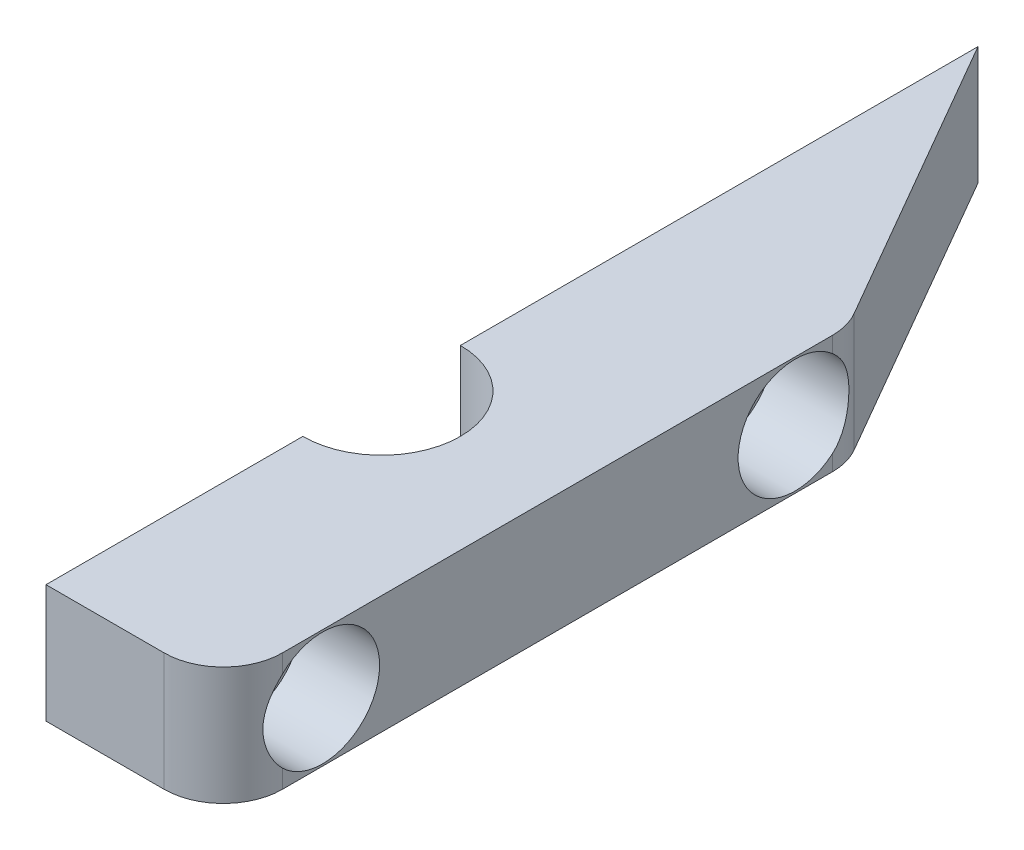
ISO-10303-21;
HEADER;
FILE_DESCRIPTION(('STEP AP214'),'2;1');
FILE_NAME('part.step','',(''),(''),'','','');
FILE_SCHEMA(('AUTOMOTIVE_DESIGN { 1 0 10303 214 1 1 1 1 }'));
ENDSEC;
DATA;
#1=APPLICATION_CONTEXT('core data for automotive mechanical design processes');
#2=APPLICATION_PROTOCOL_DEFINITION('international standard','automotive_design',2000,#1);
#3=PRODUCT_CONTEXT('',#1,'mechanical');
#4=PRODUCT('Part','Part','',(#3));
#5=PRODUCT_RELATED_PRODUCT_CATEGORY('part','',(#4));
#6=PRODUCT_DEFINITION_FORMATION('','',#4);
#7=PRODUCT_DEFINITION_CONTEXT('part definition',#1,'design');
#8=PRODUCT_DEFINITION('design','',#6,#7);
#9=PRODUCT_DEFINITION_SHAPE('','',#8);
#10=(LENGTH_UNIT() NAMED_UNIT(*) SI_UNIT(.MILLI.,.METRE.));
#11=(NAMED_UNIT(*) PLANE_ANGLE_UNIT() SI_UNIT($,.RADIAN.));
#12=(NAMED_UNIT(*) SI_UNIT($,.STERADIAN.) SOLID_ANGLE_UNIT());
#13=UNCERTAINTY_MEASURE_WITH_UNIT(LENGTH_MEASURE(1.E-05),#10,'distance_accuracy_value','');
#14=(GEOMETRIC_REPRESENTATION_CONTEXT(3) GLOBAL_UNCERTAINTY_ASSIGNED_CONTEXT((#13)) GLOBAL_UNIT_ASSIGNED_CONTEXT((#10,
#11,#12)) REPRESENTATION_CONTEXT('',''));
#15=CARTESIAN_POINT('',(0.,0.,0.));
#16=DIRECTION('',(0.,0.,1.));
#17=DIRECTION('',(1.,0.,0.));
#18=AXIS2_PLACEMENT_3D('',#15,#16,#17);
#19=CARTESIAN_POINT('',(-260.999999761582,0.,1.15907283664988E-13));
#20=DIRECTION('',(1.,0.,0.));
#21=DIRECTION('',(0.,0.,-1.));
#22=AXIS2_PLACEMENT_3D('',#19,#20,#21);
#23=PLANE('',#22);
#24=DIRECTION('',(0.,1.,0.));
#25=VECTOR('',#24,1.);
#26=CARTESIAN_POINT('',(-260.999999761582,-63.35359244469,-282.931089070943));
#27=LINE('',#26,#25);
#28=CARTESIAN_POINT('',(-260.999999761582,-5.80000000000001,-282.931089070943));
#29=VERTEX_POINT('',#28);
#30=CARTESIAN_POINT('',(-260.999999761582,0.199999999999965,-282.931089070943));
#31=VERTEX_POINT('',#30);
#32=EDGE_CURVE('E232',#29,#31,#27,.T.);
#33=ORIENTED_EDGE('',*,*,#32,.T.);
#34=DIRECTION('',(0.,0.,1.));
#35=VECTOR('',#34,1.);
#36=CARTESIAN_POINT('',(-260.999999761582,0.19999999999996,-268.967768872497));
#37=LINE('',#36,#35);
#38=CARTESIAN_POINT('',(-260.999999761582,0.19999999999997,-295.967768872497));
#39=VERTEX_POINT('',#38);
#40=EDGE_CURVE('E54',#39,#31,#37,.T.);
#41=ORIENTED_EDGE('',*,*,#40,.F.);
#42=DIRECTION('',(0.,1.,0.));
#43=VECTOR('',#42,1.);
#44=CARTESIAN_POINT('',(-260.999999761582,-63.35359244469,-295.967768872497));
#45=LINE('',#44,#43);
#46=CARTESIAN_POINT('',(-260.999999761582,-5.80000000000001,-295.967768872497));
#47=VERTEX_POINT('',#46);
#48=EDGE_CURVE('E239',#47,#39,#45,.T.);
#49=ORIENTED_EDGE('',*,*,#48,.F.);
#50=DIRECTION('',(0.,0.,-1.));
#51=VECTOR('',#50,1.);
#52=CARTESIAN_POINT('',(-260.999999761582,-5.80000000000014,1.13331797544321E-13));
#53=LINE('',#52,#51);
#54=EDGE_CURVE('E61',#29,#47,#53,.T.);
#55=ORIENTED_EDGE('',*,*,#54,.F.);
#56=EDGE_LOOP('',(#33,#41,#49,#55));
#57=FACE_BOUND('',#56,.T.);
#58=CARTESIAN_POINT('',(-260.999999761582,-2.80000000000014,-287.967768872497));
#59=DIRECTION('',(1.,0.,0.));
#60=DIRECTION('',(0.,0.,-1.));
#61=AXIS2_PLACEMENT_3D('',#58,#59,#60);
#62=CIRCLE('',#61,1.40000000000003);
#63=CARTESIAN_POINT('',(-260.999999761582,-2.80000000000014,-289.367768872497));
#64=VERTEX_POINT('',#63);
#65=EDGE_CURVE('E46',#64,#64,#62,.T.);
#66=ORIENTED_EDGE('',*,*,#65,.T.);
#67=EDGE_LOOP('',(#66));
#68=FACE_BOUND('',#67,.T.);
#69=ADVANCED_FACE('F38',(#57,#68),#23,.F.);
#70=DIRECTION('',(0.,-1.,0.));
#71=VECTOR('',#70,1.);
#72=CARTESIAN_POINT('',(-260.999999761582,-63.35359244469,-330.246986621157));
#73=LINE('',#72,#71);
#74=CARTESIAN_POINT('',(-260.999999761582,0.199999999999982,-330.246986621157));
#75=VERTEX_POINT('',#74);
#76=CARTESIAN_POINT('',(-260.999999761582,-5.8,-330.246986621157));
#77=VERTEX_POINT('',#76);
#78=EDGE_CURVE('E41',#75,#77,#73,.T.);
#79=ORIENTED_EDGE('',*,*,#78,.T.);
#80=CARTESIAN_POINT('',(-260.999999761582,-5.80000000000001,-303.967768872497));
#81=VERTEX_POINT('',#80);
#82=EDGE_CURVE('E244',#81,#77,#53,.T.);
#83=ORIENTED_EDGE('',*,*,#82,.F.);
#84=DIRECTION('',(0.,1.,0.));
#85=VECTOR('',#84,1.);
#86=CARTESIAN_POINT('',(-260.999999761582,-63.35359244469,-303.967768872497));
#87=LINE('',#86,#85);
#88=CARTESIAN_POINT('',(-260.999999761582,0.199999999999972,-303.967768872497));
#89=VERTEX_POINT('',#88);
#90=EDGE_CURVE('E241',#89,#81,#87,.F.);
#91=ORIENTED_EDGE('',*,*,#90,.F.);
#92=EDGE_CURVE('E242',#75,#89,#37,.T.);
#93=ORIENTED_EDGE('',*,*,#92,.F.);
#94=EDGE_LOOP('',(#79,#83,#91,#93));
#95=FACE_BOUND('',#94,.T.);
#96=CARTESIAN_POINT('',(-260.999999761582,-2.80000000000014,-311.967768872497));
#97=DIRECTION('',(1.,0.,0.));
#98=DIRECTION('',(0.,0.,-1.));
#99=AXIS2_PLACEMENT_3D('',#96,#97,#98);
#100=CIRCLE('',#99,1.40000000000003);
#101=CARTESIAN_POINT('',(-260.999999761582,-2.80000000000014,-313.367768872497));
#102=VERTEX_POINT('',#101);
#103=EDGE_CURVE('E11',#102,#102,#100,.T.);
#104=ORIENTED_EDGE('',*,*,#103,.T.);
#105=EDGE_LOOP('',(#104));
#106=FACE_BOUND('',#105,.T.);
#107=ADVANCED_FACE('F179',(#95,#106),#23,.F.);
#108=CARTESIAN_POINT('',(-245.999999761582,-2.80000000000014,-311.967768872497));
#109=DIRECTION('',(-1.,0.,0.));
#110=DIRECTION('',(0.,0.,1.));
#111=AXIS2_PLACEMENT_3D('',#108,#109,#110);
#112=CYLINDRICAL_SURFACE('',#111,2.9);
#113=CARTESIAN_POINT('',(-251.999999761582,-0.597828413688027,-313.854681775744));
#114=CARTESIAN_POINT('',(-252.000000187371,-0.650026521575095,-313.915606078897));
#115=CARTESIAN_POINT('',(-252.001855104516,-0.704712248521364,-313.974304651285));
#116=CARTESIAN_POINT('',(-252.00846676525,-0.818618674633444,-314.086856591232));
#117=CARTESIAN_POINT('',(-252.01322115679,-0.877835664031156,-314.140713845471));
#118=CARTESIAN_POINT('',(-252.030607777836,-1.06152007490764,-314.29437834261));
#119=CARTESIAN_POINT('',(-252.046369697883,-1.19222599039769,-314.386516679174));
#120=CARTESIAN_POINT('',(-252.080007156013,-1.46634251875561,-314.547818984672));
#121=CARTESIAN_POINT('',(-252.09787832646,-1.60972672928531,-314.617029336824));
#122=CARTESIAN_POINT('',(-252.130282134643,-1.90633621674094,-314.731197793266));
#123=CARTESIAN_POINT('',(-252.14481530553,-2.05955991707947,-314.776159772091));
#124=CARTESIAN_POINT('',(-252.161107529667,-2.29547654310155,-314.824715134062));
#125=CARTESIAN_POINT('',(-252.165639989769,-2.37613432517293,-314.837790076737));
#126=CARTESIAN_POINT('',(-252.172408172329,-2.53838319222992,-314.857097784886));
#127=CARTESIAN_POINT('',(-252.174643878262,-2.61997428392626,-314.86333050113));
#128=CARTESIAN_POINT('',(-252.176628533492,-2.7833927793076,-314.868873138064));
#129=CARTESIAN_POINT('',(-252.176378372573,-2.86522008795833,-314.86818553579));
#130=CARTESIAN_POINT('',(-252.173425432352,-3.02845815877751,-314.859912358808));
#131=CARTESIAN_POINT('',(-252.170722742133,-3.10986893596766,-314.852327034648));
#132=CARTESIAN_POINT('',(-252.15963699582,-3.34350896570897,-314.820540397204));
#133=CARTESIAN_POINT('',(-252.148341804349,-3.49449909614322,-314.787568443504));
#134=CARTESIAN_POINT('',(-252.120678661784,-3.78898318011138,-314.698274479706));
#135=CARTESIAN_POINT('',(-252.104304673654,-3.93246797376998,-314.641924653877));
#136=CARTESIAN_POINT('',(-252.070307667822,-4.21462545853687,-314.504405713176));
#137=CARTESIAN_POINT('',(-252.052661218944,-4.3528257546319,-314.422273360339));
#138=CARTESIAN_POINT('',(-252.022861430462,-4.61393095895006,-314.2360760334));
#139=CARTESIAN_POINT('',(-252.010692608637,-4.73687825630902,-314.132074110583));
#140=CARTESIAN_POINT('',(-252.003040261791,-4.87672288942201,-313.992273599532));
#141=CARTESIAN_POINT('',(-252.001919728184,-4.90255609249165,-313.965430202243));
#142=CARTESIAN_POINT('',(-252.000399964289,-4.95316097923084,-313.910776548533));
#143=CARTESIAN_POINT('',(-252.000000226606,-4.97793339762557,-313.8829669863));
#144=CARTESIAN_POINT('',(-251.999999761582,-5.00217158631223,-313.854681775744));
#145=B_SPLINE_CURVE_WITH_KNOTS('',3,(#113,#114,#115,#116,#117,#118,#119,#120,#121,#122,#123,
#124,#125,#126,#127,#128,#129,#130,#131,#132,#133,#134,#135,#136,#137,#138,#139,#140,#141,#142,
#143,#144),.UNSPECIFIED.,.F.,.F.,(4,2,2,2,2,2,2,2,2,2,2,2,2,2,2,4),(0.,0.240468749721633,
0.480742690563356,0.960360174862351,1.43900138407407,1.91756609075778,2.16280425267044,
2.40804417901727,2.65319632816666,2.89833957297843,3.36093697853722,3.82408638290194,
4.30715583472027,4.78885120851682,4.90064388869704,5.01235784296295),.UNSPECIFIED.);
#146=CARTESIAN_POINT('',(-251.999999761582,-0.597828413688027,-313.854681775744));
#147=VERTEX_POINT('',#146);
#148=CARTESIAN_POINT('',(-251.999999761582,-5.00217158631226,-313.854681775744));
#149=VERTEX_POINT('',#148);
#150=EDGE_CURVE('E116',#147,#149,#145,.T.);
#151=ORIENTED_EDGE('',*,*,#150,.F.);
#152=CARTESIAN_POINT('',(-251.999999761582,-2.80000000000014,-311.967768872497));
#153=DIRECTION('',(1.,0.,0.));
#154=DIRECTION('',(0.,0.,-1.));
#155=AXIS2_PLACEMENT_3D('',#152,#153,#154);
#156=CIRCLE('',#155,2.9);
#157=EDGE_CURVE('E120',#149,#147,#156,.F.);
#158=ORIENTED_EDGE('',*,*,#157,.F.);
#159=EDGE_LOOP('',(#151,#158));
#160=FACE_BOUND('',#159,.T.);
#161=CARTESIAN_POINT('',(-255.999999761582,-2.80000000000014,-311.967768872497));
#162=DIRECTION('',(1.,0.,0.));
#163=DIRECTION('',(0.,0.,-1.));
#164=AXIS2_PLACEMENT_3D('',#161,#162,#163);
#165=CIRCLE('',#164,2.9);
#166=CARTESIAN_POINT('',(-255.999999761582,-2.80000000000014,-314.867768872497));
#167=VERTEX_POINT('',#166);
#168=EDGE_CURVE('E288',#167,#167,#165,.T.);
#169=ORIENTED_EDGE('',*,*,#168,.F.);
#170=EDGE_LOOP('',(#169));
#171=FACE_BOUND('',#170,.T.);
#172=ADVANCED_FACE('F118',(#160,#171),#112,.F.);
#173=CARTESIAN_POINT('',(-255.999999761582,-2.80000000000014,-311.967768872497));
#174=DIRECTION('',(1.,0.,0.));
#175=DIRECTION('',(0.,0.,-1.));
#176=AXIS2_PLACEMENT_3D('',#173,#174,#175);
#177=PLANE('',#176);
#178=CARTESIAN_POINT('',(-255.999999761582,-2.80000000000014,-311.967768872497));
#179=DIRECTION('',(1.,0.,0.));
#180=DIRECTION('',(0.,0.,-1.));
#181=AXIS2_PLACEMENT_3D('',#178,#179,#180);
#182=CIRCLE('',#181,1.40000000000003);
#183=CARTESIAN_POINT('',(-255.999999761582,-2.80000000000014,-313.367768872497));
#184=VERTEX_POINT('',#183);
#185=EDGE_CURVE('E137',#184,#184,#182,.T.);
#186=ORIENTED_EDGE('',*,*,#185,.F.);
#187=EDGE_LOOP('',(#186));
#188=FACE_BOUND('',#187,.T.);
#189=ORIENTED_EDGE('',*,*,#168,.T.);
#190=EDGE_LOOP('',(#189));
#191=FACE_BOUND('',#190,.T.);
#192=ADVANCED_FACE('F178',(#188,#191),#177,.T.);
#193=CARTESIAN_POINT('',(-251.999999761582,-2.80000000000014,-311.967768872497));
#194=DIRECTION('',(-1.,0.,0.));
#195=DIRECTION('',(0.,0.,1.));
#196=AXIS2_PLACEMENT_3D('',#193,#194,#195);
#197=CYLINDRICAL_SURFACE('',#196,1.40000000000003);
#198=ORIENTED_EDGE('',*,*,#103,.F.);
#199=EDGE_LOOP('',(#198));
#200=FACE_BOUND('',#199,.T.);
#201=ORIENTED_EDGE('',*,*,#185,.T.);
#202=EDGE_LOOP('',(#201));
#203=FACE_BOUND('',#202,.T.);
#204=ADVANCED_FACE('F185',(#200,#203),#197,.F.);
#205=CARTESIAN_POINT('',(-245.999999761582,-2.80000000000014,-287.967768872497));
#206=DIRECTION('',(-1.,0.,0.));
#207=DIRECTION('',(0.,0.,1.));
#208=AXIS2_PLACEMENT_3D('',#205,#206,#207);
#209=CYLINDRICAL_SURFACE('',#208,2.9);
#210=CARTESIAN_POINT('',(-251.999999761582,-4.86444553959227,-285.931089070943));
#211=CARTESIAN_POINT('',(-252.00000252456,-4.80775508545468,-285.873620106478));
#212=CARTESIAN_POINT('',(-252.001650473643,-4.7487036266145,-285.818569681027));
#213=CARTESIAN_POINT('',(-252.007428129747,-4.62632892630314,-285.713659168226));
#214=CARTESIAN_POINT('',(-252.011556285464,-4.56300837699605,-285.663795859323));
#215=CARTESIAN_POINT('',(-252.026442191381,-4.36735519336352,-285.522519714868));
#216=CARTESIAN_POINT('',(-252.039705062863,-4.22920013440546,-285.439288454943));
#217=CARTESIAN_POINT('',(-252.066886885522,-3.94125802647384,-285.296946943974));
#218=CARTESIAN_POINT('',(-252.080805032844,-3.79148509067637,-285.237807955866));
#219=CARTESIAN_POINT('',(-252.098516186779,-3.5609755261849,-285.168237390592));
#220=CARTESIAN_POINT('',(-252.103893102041,-3.48314534247364,-285.148234449315));
#221=CARTESIAN_POINT('',(-252.113152099623,-3.32601645962309,-285.114744107614));
#222=CARTESIAN_POINT('',(-252.11703471826,-3.24671829808457,-285.101254369098));
#223=CARTESIAN_POINT('',(-252.122993526852,-3.08657606788225,-285.080825302122));
#224=CARTESIAN_POINT('',(-252.125055126845,-3.00572472362878,-285.073938842118));
#225=CARTESIAN_POINT('',(-252.127143642019,-2.84370189918896,-285.066964629703));
#226=CARTESIAN_POINT('',(-252.127170543189,-2.76253041680219,-285.066876924103));
#227=CARTESIAN_POINT('',(-252.125184527453,-2.60047688957788,-285.073504700247));
#228=CARTESIAN_POINT('',(-252.123171358501,-2.51959488174332,-285.080221022613));
#229=CARTESIAN_POINT('',(-252.117285759445,-2.35873544117113,-285.100389017866));
#230=CARTESIAN_POINT('',(-252.113412667294,-2.27875834092319,-285.113843089159));
#231=CARTESIAN_POINT('',(-252.099774279366,-2.04630568238977,-285.163054439298));
#232=CARTESIAN_POINT('',(-252.087882629762,-1.89578455462985,-285.207909853903));
#233=CARTESIAN_POINT('',(-252.062091473228,-1.60421452074077,-285.321150656782));
#234=CARTESIAN_POINT('',(-252.04819282256,-1.46316161251883,-285.38952602767));
#235=CARTESIAN_POINT('',(-252.02589609283,-1.22034697410305,-285.53252550754));
#236=CARTESIAN_POINT('',(-252.016953784405,-1.11632840757002,-285.603245942077));
#237=CARTESIAN_POINT('',(-252.004019269608,-0.918137996895041,-285.757691254981));
#238=CARTESIAN_POINT('',(-252.000026836801,-0.823965702508266,-285.841415538281));
#239=CARTESIAN_POINT('',(-251.999999761582,-0.735554460408018,-285.931089070943));
#240=B_SPLINE_CURVE_WITH_KNOTS('',3,(#210,#211,#212,#213,#214,#215,#216,#217,#218,#219,#220,
#221,#222,#223,#224,#225,#226,#227,#228,#229,#230,#231,#232,#233,#234,#235,#236,#237,#238,#239),
.UNSPECIFIED.,.F.,.F.,(4,2,2,2,2,2,2,2,2,2,2,2,2,2,4),(0.,0.241978076412384,0.483804959237865,
0.966908102126228,1.44943330436018,1.69080732839696,1.93209464011422,2.17529804982675,
2.418503134085,2.66173826941672,2.90506004961743,3.37532589767167,3.84539170224438,
4.22258443633444,4.59975991481584),.UNSPECIFIED.);
#241=CARTESIAN_POINT('',(-251.999999761582,-4.86444553959227,-285.931089070943));
#242=VERTEX_POINT('',#241);
#243=CARTESIAN_POINT('',(-251.999999761582,-0.735554460408013,-285.931089070943));
#244=VERTEX_POINT('',#243);
#245=EDGE_CURVE('E125',#242,#244,#240,.T.);
#246=ORIENTED_EDGE('',*,*,#245,.F.);
#247=CARTESIAN_POINT('',(-251.999999761582,-2.80000000000014,-287.967768872497));
#248=DIRECTION('',(1.,0.,0.));
#249=DIRECTION('',(0.,0.,-1.));
#250=AXIS2_PLACEMENT_3D('',#247,#248,#249);
#251=CIRCLE('',#250,2.9);
#252=EDGE_CURVE('E136',#244,#242,#251,.F.);
#253=ORIENTED_EDGE('',*,*,#252,.F.);
#254=EDGE_LOOP('',(#246,#253));
#255=FACE_BOUND('',#254,.T.);
#256=CARTESIAN_POINT('',(-255.999999761582,-2.80000000000014,-287.967768872497));
#257=DIRECTION('',(1.,0.,0.));
#258=DIRECTION('',(0.,0.,-1.));
#259=AXIS2_PLACEMENT_3D('',#256,#257,#258);
#260=CIRCLE('',#259,2.9);
#261=CARTESIAN_POINT('',(-255.999999761582,-2.80000000000014,-290.867768872497));
#262=VERTEX_POINT('',#261);
#263=EDGE_CURVE('E160',#262,#262,#260,.T.);
#264=ORIENTED_EDGE('',*,*,#263,.F.);
#265=EDGE_LOOP('',(#264));
#266=FACE_BOUND('',#265,.T.);
#267=ADVANCED_FACE('F180',(#255,#266),#209,.F.);
#268=CARTESIAN_POINT('',(-255.999999761582,-2.80000000000014,-287.967768872497));
#269=DIRECTION('',(1.,0.,0.));
#270=DIRECTION('',(0.,0.,-1.));
#271=AXIS2_PLACEMENT_3D('',#268,#269,#270);
#272=PLANE('',#271);
#273=CARTESIAN_POINT('',(-255.999999761582,-2.80000000000014,-287.967768872497));
#274=DIRECTION('',(1.,0.,0.));
#275=DIRECTION('',(0.,0.,-1.));
#276=AXIS2_PLACEMENT_3D('',#273,#274,#275);
#277=CIRCLE('',#276,1.40000000000003);
#278=CARTESIAN_POINT('',(-255.999999761582,-2.80000000000014,-289.367768872497));
#279=VERTEX_POINT('',#278);
#280=EDGE_CURVE('E157',#279,#279,#277,.T.);
#281=ORIENTED_EDGE('',*,*,#280,.F.);
#282=EDGE_LOOP('',(#281));
#283=FACE_BOUND('',#282,.T.);
#284=ORIENTED_EDGE('',*,*,#263,.T.);
#285=EDGE_LOOP('',(#284));
#286=FACE_BOUND('',#285,.T.);
#287=ADVANCED_FACE('F190',(#283,#286),#272,.T.);
#288=CARTESIAN_POINT('',(-251.999999761582,-2.80000000000014,-287.967768872497));
#289=DIRECTION('',(-1.,0.,0.));
#290=DIRECTION('',(0.,0.,1.));
#291=AXIS2_PLACEMENT_3D('',#288,#289,#290);
#292=CYLINDRICAL_SURFACE('',#291,1.40000000000003);
#293=ORIENTED_EDGE('',*,*,#65,.F.);
#294=EDGE_LOOP('',(#293));
#295=FACE_BOUND('',#294,.T.);
#296=ORIENTED_EDGE('',*,*,#280,.T.);
#297=EDGE_LOOP('',(#296));
#298=FACE_BOUND('',#297,.T.);
#299=ADVANCED_FACE('F187',(#295,#298),#292,.F.);
#300=CARTESIAN_POINT('',(-251.999999761582,-63.35359244469,-299.967768872497));
#301=DIRECTION('',(1.,0.,0.));
#302=DIRECTION('',(0.,0.,-1.));
#303=AXIS2_PLACEMENT_3D('',#300,#301,#302);
#304=PLANE('',#303);
#305=DIRECTION('',(0.,1.,0.));
#306=VECTOR('',#305,1.);
#307=CARTESIAN_POINT('',(-251.999999761582,-63.35359244469,-285.931089070943));
#308=LINE('',#307,#306);
#309=CARTESIAN_POINT('',(-251.999999761582,0.199999999999966,-285.931089070943));
#310=VERTEX_POINT('',#309);
#311=EDGE_CURVE('E149',#310,#244,#308,.F.);
#312=ORIENTED_EDGE('',*,*,#311,.T.);
#313=ORIENTED_EDGE('',*,*,#252,.T.);
#314=CARTESIAN_POINT('',(-251.999999761582,-5.80000000000001,-285.931089070943));
#315=VERTEX_POINT('',#314);
#316=EDGE_CURVE('E145',#242,#315,#308,.F.);
#317=ORIENTED_EDGE('',*,*,#316,.T.);
#318=DIRECTION('',(0.,0.,1.));
#319=VECTOR('',#318,1.);
#320=CARTESIAN_POINT('',(-251.999999761582,-5.80000000000001,-299.967768872497));
#321=LINE('',#320,#319);
#322=CARTESIAN_POINT('',(-251.999999761582,-5.8,-313.854681775744));
#323=VERTEX_POINT('',#322);
#324=EDGE_CURVE('E262',#323,#315,#321,.T.);
#325=ORIENTED_EDGE('',*,*,#324,.F.);
#326=DIRECTION('',(0.,1.,0.));
#327=VECTOR('',#326,1.);
#328=CARTESIAN_POINT('',(-251.999999761582,-63.35359244469,-313.854681775744));
#329=LINE('',#328,#327);
#330=EDGE_CURVE('E135',#323,#149,#329,.T.);
#331=ORIENTED_EDGE('',*,*,#330,.T.);
#332=ORIENTED_EDGE('',*,*,#157,.T.);
#333=CARTESIAN_POINT('',(-251.999999761582,0.199999999999976,-313.854681775744));
#334=VERTEX_POINT('',#333);
#335=EDGE_CURVE('E132',#147,#334,#329,.T.);
#336=ORIENTED_EDGE('',*,*,#335,.T.);
#337=DIRECTION('',(0.,0.,-1.));
#338=VECTOR('',#337,1.);
#339=CARTESIAN_POINT('',(-251.999999761582,0.199999999999971,-299.967768872497));
#340=LINE('',#339,#338);
#341=EDGE_CURVE('E265',#310,#334,#340,.T.);
#342=ORIENTED_EDGE('',*,*,#341,.F.);
#343=EDGE_LOOP('',(#312,#313,#317,#325,#331,#332,#336,#342));
#344=FACE_BOUND('',#343,.T.);
#345=ADVANCED_FACE('F130',(#344),#304,.T.);
#346=CARTESIAN_POINT('',(-254.999999761582,-63.35359244469,-313.854681775744));
#347=DIRECTION('',(0.,1.,0.));
#348=DIRECTION('',(0.,0.,1.));
#349=AXIS2_PLACEMENT_3D('',#346,#347,#348);
#350=CYLINDRICAL_SURFACE('',#349,3.);
#351=ORIENTED_EDGE('',*,*,#335,.F.);
#352=ORIENTED_EDGE('',*,*,#150,.T.);
#353=ORIENTED_EDGE('',*,*,#330,.F.);
#354=CARTESIAN_POINT('',(-254.999999761582,-5.8,-313.854681775744));
#355=DIRECTION('',(0.,1.,0.));
#356=DIRECTION('',(0.,0.,1.));
#357=AXIS2_PLACEMENT_3D('',#354,#355,#356);
#358=CIRCLE('',#357,3.);
#359=CARTESIAN_POINT('',(-252.401923550229,-5.8,-315.354681775744));
#360=VERTEX_POINT('',#359);
#361=EDGE_CURVE('E151',#360,#323,#358,.F.);
#362=ORIENTED_EDGE('',*,*,#361,.F.);
#363=DIRECTION('',(0.,1.,0.));
#364=VECTOR('',#363,1.);
#365=CARTESIAN_POINT('',(-252.401923550229,-63.35359244469,-315.354681775744));
#366=LINE('',#365,#364);
#367=CARTESIAN_POINT('',(-252.401923550229,0.199999999999977,-315.354681775744));
#368=VERTEX_POINT('',#367);
#369=EDGE_CURVE('E126',#368,#360,#366,.F.);
#370=ORIENTED_EDGE('',*,*,#369,.F.);
#371=CARTESIAN_POINT('',(-254.999999761582,0.199999999999978,-313.854681775744));
#372=DIRECTION('',(0.,-1.,0.));
#373=DIRECTION('',(0.,0.,-1.));
#374=AXIS2_PLACEMENT_3D('',#371,#372,#373);
#375=CIRCLE('',#374,3.);
#376=EDGE_CURVE('E141',#334,#368,#375,.F.);
#377=ORIENTED_EDGE('',*,*,#376,.F.);
#378=EDGE_LOOP('',(#351,#352,#353,#362,#370,#377));
#379=FACE_BOUND('',#378,.T.);
#380=ADVANCED_FACE('F139',(#379),#350,.T.);
#381=CARTESIAN_POINT('',(-254.999999761582,-63.35359244469,-285.931089070943));
#382=DIRECTION('',(0.,1.,0.));
#383=DIRECTION('',(0.,0.,1.));
#384=AXIS2_PLACEMENT_3D('',#381,#382,#383);
#385=CYLINDRICAL_SURFACE('',#384,3.);
#386=ORIENTED_EDGE('',*,*,#316,.F.);
#387=ORIENTED_EDGE('',*,*,#245,.T.);
#388=ORIENTED_EDGE('',*,*,#311,.F.);
#389=CARTESIAN_POINT('',(-254.999999761582,0.199999999999964,-285.931089070943));
#390=DIRECTION('',(0.,-1.,0.));
#391=DIRECTION('',(0.,0.,-1.));
#392=AXIS2_PLACEMENT_3D('',#389,#390,#391);
#393=CIRCLE('',#392,3.);
#394=CARTESIAN_POINT('',(-254.999999761582,0.199999999999965,-282.931089070943));
#395=VERTEX_POINT('',#394);
#396=EDGE_CURVE('E143',#395,#310,#393,.F.);
#397=ORIENTED_EDGE('',*,*,#396,.F.);
#398=DIRECTION('',(0.,1.,0.));
#399=VECTOR('',#398,1.);
#400=CARTESIAN_POINT('',(-254.999999761582,-63.35359244469,-282.931089070943));
#401=LINE('',#400,#399);
#402=CARTESIAN_POINT('',(-254.999999761582,-5.80000000000001,-282.931089070943));
#403=VERTEX_POINT('',#402);
#404=EDGE_CURVE('E257',#403,#395,#401,.T.);
#405=ORIENTED_EDGE('',*,*,#404,.F.);
#406=CARTESIAN_POINT('',(-254.999999761582,-5.80000000000001,-285.931089070943));
#407=DIRECTION('',(0.,1.,0.));
#408=DIRECTION('',(0.,0.,1.));
#409=AXIS2_PLACEMENT_3D('',#406,#407,#408);
#410=CIRCLE('',#409,3.);
#411=EDGE_CURVE('E153',#315,#403,#410,.F.);
#412=ORIENTED_EDGE('',*,*,#411,.F.);
#413=EDGE_LOOP('',(#386,#387,#388,#397,#405,#412));
#414=FACE_BOUND('',#413,.T.);
#415=ADVANCED_FACE('F214',(#414),#385,.T.);
#416=CARTESIAN_POINT('',(0.,-5.80000000000014,0.));
#417=DIRECTION('',(0.,1.,0.));
#418=DIRECTION('',(0.,0.,1.));
#419=AXIS2_PLACEMENT_3D('',#416,#417,#418);
#420=PLANE('',#419);
#421=DIRECTION('',(-1.,0.,0.));
#422=VECTOR('',#421,1.);
#423=CARTESIAN_POINT('',(-251.999999761582,-5.80000000000001,-282.931089070943));
#424=LINE('',#423,#422);
#425=EDGE_CURVE('E276',#403,#29,#424,.T.);
#426=ORIENTED_EDGE('',*,*,#425,.T.);
#427=ORIENTED_EDGE('',*,*,#54,.T.);
#428=CARTESIAN_POINT('',(-260.999999761582,-5.80000000000001,-299.967768872497));
#429=DIRECTION('',(0.,1.,0.));
#430=DIRECTION('',(0.,0.,1.));
#431=AXIS2_PLACEMENT_3D('',#428,#429,#430);
#432=CIRCLE('',#431,3.99999999999999);
#433=EDGE_CURVE('E250',#81,#47,#432,.F.);
#434=ORIENTED_EDGE('',*,*,#433,.F.);
#435=ORIENTED_EDGE('',*,*,#82,.T.);
#436=DIRECTION('',(0.499999999999998,0.,0.86602540378444));
#437=VECTOR('',#436,1.);
#438=CARTESIAN_POINT('',(-264.321503550095,-5.79999999999999,-335.999999940395));
#439=LINE('',#438,#437);
#440=EDGE_CURVE('E258',#77,#360,#439,.T.);
#441=ORIENTED_EDGE('',*,*,#440,.T.);
#442=ORIENTED_EDGE('',*,*,#361,.T.);
#443=ORIENTED_EDGE('',*,*,#324,.T.);
#444=ORIENTED_EDGE('',*,*,#411,.T.);
#445=EDGE_LOOP('',(#426,#427,#434,#435,#441,#442,#443,#444));
#446=FACE_BOUND('',#445,.T.);
#447=ADVANCED_FACE('F212',(#446),#420,.F.);
#448=CARTESIAN_POINT('',(-268.999999761582,0.19999999999996,-268.967768872497));
#449=DIRECTION('',(0.,-1.,0.));
#450=DIRECTION('',(0.,0.,-1.));
#451=AXIS2_PLACEMENT_3D('',#448,#449,#450);
#452=PLANE('',#451);
#453=DIRECTION('',(-0.499999999999998,0.,-0.86602540378444));
#454=VECTOR('',#453,1.);
#455=CARTESIAN_POINT('',(-264.321503550095,0.199999999999984,-335.999999940395));
#456=LINE('',#455,#454);
#457=EDGE_CURVE('E269',#368,#75,#456,.T.);
#458=ORIENTED_EDGE('',*,*,#457,.T.);
#459=ORIENTED_EDGE('',*,*,#92,.T.);
#460=CARTESIAN_POINT('',(-260.999999761582,0.199999999999971,-299.967768872497));
#461=DIRECTION('',(0.,1.,0.));
#462=DIRECTION('',(0.,0.,1.));
#463=AXIS2_PLACEMENT_3D('',#460,#461,#462);
#464=CIRCLE('',#463,3.99999999999999);
#465=EDGE_CURVE('E251',#39,#89,#464,.T.);
#466=ORIENTED_EDGE('',*,*,#465,.F.);
#467=ORIENTED_EDGE('',*,*,#40,.T.);
#468=DIRECTION('',(1.,0.,0.));
#469=VECTOR('',#468,1.);
#470=CARTESIAN_POINT('',(-251.999999761582,0.199999999999965,-282.931089070943));
#471=LINE('',#470,#469);
#472=EDGE_CURVE('E271',#31,#395,#471,.T.);
#473=ORIENTED_EDGE('',*,*,#472,.T.);
#474=ORIENTED_EDGE('',*,*,#396,.T.);
#475=ORIENTED_EDGE('',*,*,#341,.T.);
#476=ORIENTED_EDGE('',*,*,#376,.T.);
#477=EDGE_LOOP('',(#458,#459,#466,#467,#473,#474,#475,#476));
#478=FACE_BOUND('',#477,.T.);
#479=ADVANCED_FACE('F199',(#478),#452,.F.);
#480=CARTESIAN_POINT('',(-260.999999761582,-63.35359244469,-299.967768872497));
#481=DIRECTION('',(0.,1.,0.));
#482=DIRECTION('',(0.,0.,1.));
#483=AXIS2_PLACEMENT_3D('',#480,#481,#482);
#484=CYLINDRICAL_SURFACE('',#483,3.99999999999999);
#485=ORIENTED_EDGE('',*,*,#465,.T.);
#486=ORIENTED_EDGE('',*,*,#90,.T.);
#487=ORIENTED_EDGE('',*,*,#433,.T.);
#488=ORIENTED_EDGE('',*,*,#48,.T.);
#489=EDGE_LOOP('',(#485,#486,#487,#488));
#490=FACE_BOUND('',#489,.T.);
#491=ADVANCED_FACE('F195',(#490),#484,.F.);
#492=CARTESIAN_POINT('',(-251.999999761582,-63.35359244469,-282.931089070943));
#493=DIRECTION('',(0.,0.,1.));
#494=DIRECTION('',(0.,-1.,0.));
#495=AXIS2_PLACEMENT_3D('',#492,#493,#494);
#496=PLANE('',#495);
#497=ORIENTED_EDGE('',*,*,#32,.F.);
#498=ORIENTED_EDGE('',*,*,#425,.F.);
#499=ORIENTED_EDGE('',*,*,#404,.T.);
#500=ORIENTED_EDGE('',*,*,#472,.F.);
#501=EDGE_LOOP('',(#497,#498,#499,#500));
#502=FACE_BOUND('',#501,.T.);
#503=ADVANCED_FACE('F198',(#502),#496,.T.);
#504=CARTESIAN_POINT('',(-264.321503550095,-63.35359244469,-335.999999940395));
#505=DIRECTION('',(0.86602540378444,0.,-0.499999999999998));
#506=DIRECTION('',(-0.499999999999998,0.,-0.86602540378444));
#507=AXIS2_PLACEMENT_3D('',#504,#505,#506);
#508=PLANE('',#507);
#509=ORIENTED_EDGE('',*,*,#78,.F.);
#510=ORIENTED_EDGE('',*,*,#457,.F.);
#511=ORIENTED_EDGE('',*,*,#369,.T.);
#512=ORIENTED_EDGE('',*,*,#440,.F.);
#513=EDGE_LOOP('',(#509,#510,#511,#512));
#514=FACE_BOUND('',#513,.T.);
#515=ADVANCED_FACE('F205',(#514),#508,.T.);
#516=CLOSED_SHELL('',(#69,#107,#172,#192,#204,#267,#287,#299,#345,#380,#415,#447,#479,#491,#503,#515));
#517=MANIFOLD_SOLID_BREP('B2',#516);
#518=ADVANCED_BREP_SHAPE_REPRESENTATION('',(#18,#517),#14);
#519=SHAPE_DEFINITION_REPRESENTATION(#9,#518);
ENDSEC;
END-ISO-10303-21;
